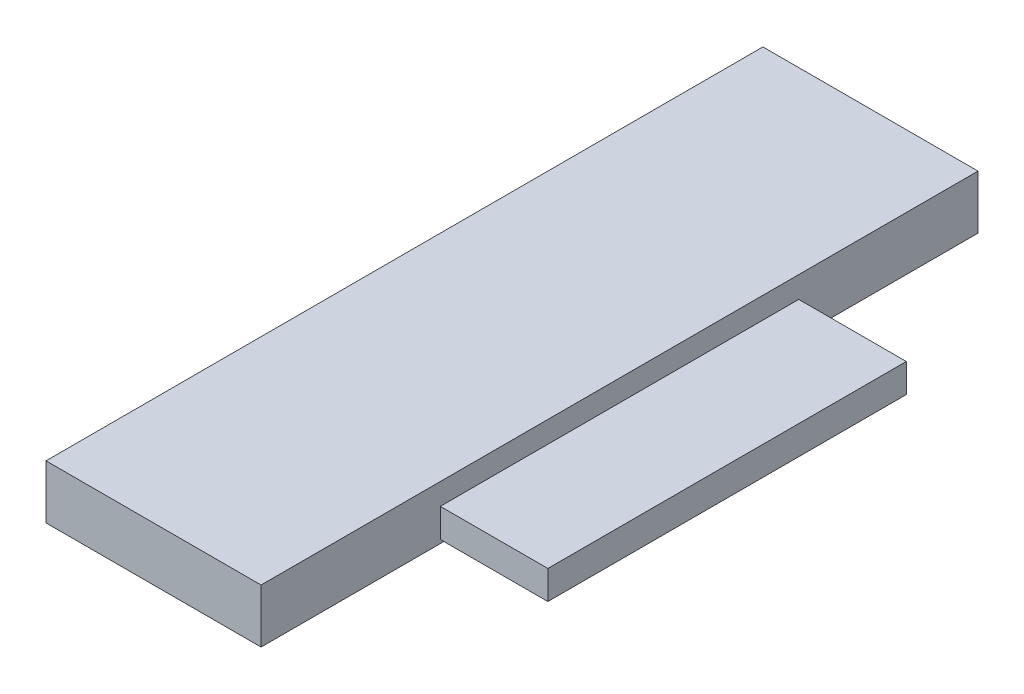
ISO-10303-21;
HEADER;
FILE_DESCRIPTION(('STEP AP214'),'2;1');
FILE_NAME('part.step','',(''),(''),'','','');
FILE_SCHEMA(('AUTOMOTIVE_DESIGN { 1 0 10303 214 1 1 1 1 }'));
ENDSEC;
DATA;
#1=APPLICATION_CONTEXT('core data for automotive mechanical design processes');
#2=APPLICATION_PROTOCOL_DEFINITION('international standard','automotive_design',2000,#1);
#3=PRODUCT_CONTEXT('',#1,'mechanical');
#4=PRODUCT('Part','Part','',(#3));
#5=PRODUCT_RELATED_PRODUCT_CATEGORY('part','',(#4));
#6=PRODUCT_DEFINITION_FORMATION('','',#4);
#7=PRODUCT_DEFINITION_CONTEXT('part definition',#1,'design');
#8=PRODUCT_DEFINITION('design','',#6,#7);
#9=PRODUCT_DEFINITION_SHAPE('','',#8);
#10=(LENGTH_UNIT() NAMED_UNIT(*) SI_UNIT(.MILLI.,.METRE.));
#11=(NAMED_UNIT(*) PLANE_ANGLE_UNIT() SI_UNIT($,.RADIAN.));
#12=(NAMED_UNIT(*) SI_UNIT($,.STERADIAN.) SOLID_ANGLE_UNIT());
#13=UNCERTAINTY_MEASURE_WITH_UNIT(LENGTH_MEASURE(1.E-05),#10,'distance_accuracy_value','');
#14=(GEOMETRIC_REPRESENTATION_CONTEXT(3) GLOBAL_UNCERTAINTY_ASSIGNED_CONTEXT((#13)) GLOBAL_UNIT_ASSIGNED_CONTEXT((#10,
#11,#12)) REPRESENTATION_CONTEXT('',''));
#15=CARTESIAN_POINT('',(0.,0.,0.));
#16=DIRECTION('',(0.,0.,1.));
#17=DIRECTION('',(1.,0.,0.));
#18=AXIS2_PLACEMENT_3D('',#15,#16,#17);
#19=CARTESIAN_POINT('',(0.,3.75,-50.));
#20=DIRECTION('',(-1.,0.,0.));
#21=DIRECTION('',(0.,0.,1.));
#22=AXIS2_PLACEMENT_3D('',#19,#20,#21);
#23=PLANE('',#22);
#24=DIRECTION('',(0.,0.,-1.));
#25=VECTOR('',#24,1.);
#26=CARTESIAN_POINT('',(0.,-3.75,-50.));
#27=LINE('',#26,#25);
#28=CARTESIAN_POINT('',(0.,-3.75,50.));
#29=VERTEX_POINT('',#28);
#30=CARTESIAN_POINT('',(0.,-3.75,-50.));
#31=VERTEX_POINT('',#30);
#32=EDGE_CURVE('E165',#29,#31,#27,.T.);
#33=ORIENTED_EDGE('',*,*,#32,.T.);
#34=DIRECTION('',(0.,-1.,0.));
#35=VECTOR('',#34,1.);
#36=CARTESIAN_POINT('',(0.,3.75,-50.));
#37=LINE('',#36,#35);
#38=CARTESIAN_POINT('',(0.,3.75,-50.));
#39=VERTEX_POINT('',#38);
#40=EDGE_CURVE('E169',#39,#31,#37,.T.);
#41=ORIENTED_EDGE('',*,*,#40,.F.);
#42=DIRECTION('',(0.,0.,-1.));
#43=VECTOR('',#42,1.);
#44=CARTESIAN_POINT('',(0.,3.75,-50.));
#45=LINE('',#44,#43);
#46=CARTESIAN_POINT('',(0.,3.75,50.));
#47=VERTEX_POINT('',#46);
#48=EDGE_CURVE('E157',#47,#39,#45,.T.);
#49=ORIENTED_EDGE('',*,*,#48,.F.);
#50=DIRECTION('',(0.,-1.,0.));
#51=VECTOR('',#50,1.);
#52=CARTESIAN_POINT('',(0.,3.75,50.));
#53=LINE('',#52,#51);
#54=EDGE_CURVE('E49',#47,#29,#53,.T.);
#55=ORIENTED_EDGE('',*,*,#54,.T.);
#56=EDGE_LOOP('',(#33,#41,#49,#55));
#57=FACE_BOUND('',#56,.T.);
#58=DIRECTION('',(0.,0.,1.));
#59=VECTOR('',#58,1.);
#60=CARTESIAN_POINT('',(0.,0.75,-25.));
#61=LINE('',#60,#59);
#62=CARTESIAN_POINT('',(0.,0.75,-25.));
#63=VERTEX_POINT('',#62);
#64=CARTESIAN_POINT('',(0.,0.75,25.));
#65=VERTEX_POINT('',#64);
#66=EDGE_CURVE('E56',#63,#65,#61,.T.);
#67=ORIENTED_EDGE('',*,*,#66,.F.);
#68=DIRECTION('',(0.,1.,0.));
#69=VECTOR('',#68,1.);
#70=CARTESIAN_POINT('',(0.,-3.25,-25.));
#71=LINE('',#70,#69);
#72=CARTESIAN_POINT('',(0.,-3.25,-25.));
#73=VERTEX_POINT('',#72);
#74=EDGE_CURVE('E137',#73,#63,#71,.T.);
#75=ORIENTED_EDGE('',*,*,#74,.F.);
#76=DIRECTION('',(0.,0.,1.));
#77=VECTOR('',#76,1.);
#78=CARTESIAN_POINT('',(0.,-3.25,-25.));
#79=LINE('',#78,#77);
#80=CARTESIAN_POINT('',(0.,-3.25,25.));
#81=VERTEX_POINT('',#80);
#82=EDGE_CURVE('E131',#73,#81,#79,.T.);
#83=ORIENTED_EDGE('',*,*,#82,.T.);
#84=DIRECTION('',(0.,1.,0.));
#85=VECTOR('',#84,1.);
#86=CARTESIAN_POINT('',(0.,-3.25,25.));
#87=LINE('',#86,#85);
#88=EDGE_CURVE('E117',#81,#65,#87,.T.);
#89=ORIENTED_EDGE('',*,*,#88,.T.);
#90=EDGE_LOOP('',(#67,#75,#83,#89));
#91=FACE_BOUND('',#90,.T.);
#92=ADVANCED_FACE('F41',(#57,#91),#23,.F.);
#93=CARTESIAN_POINT('',(-30.,3.75,-50.));
#94=DIRECTION('',(1.,0.,0.));
#95=DIRECTION('',(0.,0.,-1.));
#96=AXIS2_PLACEMENT_3D('',#93,#94,#95);
#97=PLANE('',#96);
#98=DIRECTION('',(0.,0.,1.));
#99=VECTOR('',#98,1.);
#100=CARTESIAN_POINT('',(-30.,-3.75,-50.));
#101=LINE('',#100,#99);
#102=CARTESIAN_POINT('',(-30.,-3.75,-50.));
#103=VERTEX_POINT('',#102);
#104=CARTESIAN_POINT('',(-30.,-3.75,50.));
#105=VERTEX_POINT('',#104);
#106=EDGE_CURVE('E150',#103,#105,#101,.T.);
#107=ORIENTED_EDGE('',*,*,#106,.T.);
#108=DIRECTION('',(0.,-1.,0.));
#109=VECTOR('',#108,1.);
#110=CARTESIAN_POINT('',(-30.,3.75,50.));
#111=LINE('',#110,#109);
#112=CARTESIAN_POINT('',(-30.,3.75,50.));
#113=VERTEX_POINT('',#112);
#114=EDGE_CURVE('E11',#113,#105,#111,.T.);
#115=ORIENTED_EDGE('',*,*,#114,.F.);
#116=DIRECTION('',(0.,0.,1.));
#117=VECTOR('',#116,1.);
#118=CARTESIAN_POINT('',(-30.,3.75,-50.));
#119=LINE('',#118,#117);
#120=CARTESIAN_POINT('',(-30.,3.75,-50.));
#121=VERTEX_POINT('',#120);
#122=EDGE_CURVE('E154',#121,#113,#119,.T.);
#123=ORIENTED_EDGE('',*,*,#122,.F.);
#124=DIRECTION('',(0.,-1.,0.));
#125=VECTOR('',#124,1.);
#126=CARTESIAN_POINT('',(-30.,3.75,-50.));
#127=LINE('',#126,#125);
#128=EDGE_CURVE('E160',#121,#103,#127,.T.);
#129=ORIENTED_EDGE('',*,*,#128,.T.);
#130=EDGE_LOOP('',(#107,#115,#123,#129));
#131=FACE_BOUND('',#130,.T.);
#132=ADVANCED_FACE('F43',(#131),#97,.F.);
#133=CARTESIAN_POINT('',(-30.,3.75,50.));
#134=DIRECTION('',(0.,0.,-1.));
#135=DIRECTION('',(-1.,0.,0.));
#136=AXIS2_PLACEMENT_3D('',#133,#134,#135);
#137=PLANE('',#136);
#138=DIRECTION('',(1.,0.,0.));
#139=VECTOR('',#138,1.);
#140=CARTESIAN_POINT('',(-30.,-3.75,50.));
#141=LINE('',#140,#139);
#142=EDGE_CURVE('E163',#105,#29,#141,.T.);
#143=ORIENTED_EDGE('',*,*,#142,.T.);
#144=ORIENTED_EDGE('',*,*,#54,.F.);
#145=DIRECTION('',(1.,0.,0.));
#146=VECTOR('',#145,1.);
#147=CARTESIAN_POINT('',(-30.,3.75,50.));
#148=LINE('',#147,#146);
#149=EDGE_CURVE('E93',#113,#47,#148,.T.);
#150=ORIENTED_EDGE('',*,*,#149,.F.);
#151=ORIENTED_EDGE('',*,*,#114,.T.);
#152=EDGE_LOOP('',(#143,#144,#150,#151));
#153=FACE_BOUND('',#152,.T.);
#154=ADVANCED_FACE('F184',(#153),#137,.F.);
#155=CARTESIAN_POINT('',(-30.,3.75,-50.));
#156=DIRECTION('',(0.,0.,1.));
#157=DIRECTION('',(1.,0.,0.));
#158=AXIS2_PLACEMENT_3D('',#155,#156,#157);
#159=PLANE('',#158);
#160=DIRECTION('',(-1.,0.,0.));
#161=VECTOR('',#160,1.);
#162=CARTESIAN_POINT('',(-30.,-3.75,-50.));
#163=LINE('',#162,#161);
#164=EDGE_CURVE('E86',#31,#103,#163,.T.);
#165=ORIENTED_EDGE('',*,*,#164,.T.);
#166=ORIENTED_EDGE('',*,*,#128,.F.);
#167=DIRECTION('',(-1.,0.,0.));
#168=VECTOR('',#167,1.);
#169=CARTESIAN_POINT('',(-30.,3.75,-50.));
#170=LINE('',#169,#168);
#171=EDGE_CURVE('E65',#39,#121,#170,.T.);
#172=ORIENTED_EDGE('',*,*,#171,.F.);
#173=ORIENTED_EDGE('',*,*,#40,.T.);
#174=EDGE_LOOP('',(#165,#166,#172,#173));
#175=FACE_BOUND('',#174,.T.);
#176=ADVANCED_FACE('F181',(#175),#159,.F.);
#177=CARTESIAN_POINT('',(0.,3.75,0.));
#178=DIRECTION('',(0.,1.,0.));
#179=DIRECTION('',(0.,0.,1.));
#180=AXIS2_PLACEMENT_3D('',#177,#178,#179);
#181=PLANE('',#180);
#182=ORIENTED_EDGE('',*,*,#122,.T.);
#183=ORIENTED_EDGE('',*,*,#149,.T.);
#184=ORIENTED_EDGE('',*,*,#48,.T.);
#185=ORIENTED_EDGE('',*,*,#171,.T.);
#186=EDGE_LOOP('',(#182,#183,#184,#185));
#187=FACE_BOUND('',#186,.T.);
#188=ADVANCED_FACE('F183',(#187),#181,.T.);
#189=CARTESIAN_POINT('',(0.,-3.75,0.));
#190=DIRECTION('',(0.,1.,0.));
#191=DIRECTION('',(0.,0.,1.));
#192=AXIS2_PLACEMENT_3D('',#189,#190,#191);
#193=PLANE('',#192);
#194=ORIENTED_EDGE('',*,*,#106,.F.);
#195=ORIENTED_EDGE('',*,*,#164,.F.);
#196=ORIENTED_EDGE('',*,*,#32,.F.);
#197=ORIENTED_EDGE('',*,*,#142,.F.);
#198=EDGE_LOOP('',(#194,#195,#196,#197));
#199=FACE_BOUND('',#198,.T.);
#200=ADVANCED_FACE('F177',(#199),#193,.F.);
#201=CARTESIAN_POINT('',(0.,-3.25,-25.));
#202=DIRECTION('',(0.,0.,-1.));
#203=DIRECTION('',(-1.,0.,0.));
#204=AXIS2_PLACEMENT_3D('',#201,#202,#203);
#205=PLANE('',#204);
#206=DIRECTION('',(-1.,0.,0.));
#207=VECTOR('',#206,1.);
#208=CARTESIAN_POINT('',(0.,0.75,-25.));
#209=LINE('',#208,#207);
#210=CARTESIAN_POINT('',(15.,0.75,-25.));
#211=VERTEX_POINT('',#210);
#212=EDGE_CURVE('E138',#211,#63,#209,.T.);
#213=ORIENTED_EDGE('',*,*,#212,.F.);
#214=DIRECTION('',(0.,1.,0.));
#215=VECTOR('',#214,1.);
#216=CARTESIAN_POINT('',(15.,-3.25,-25.));
#217=LINE('',#216,#215);
#218=CARTESIAN_POINT('',(15.,-3.25,-25.));
#219=VERTEX_POINT('',#218);
#220=EDGE_CURVE('E151',#219,#211,#217,.T.);
#221=ORIENTED_EDGE('',*,*,#220,.F.);
#222=DIRECTION('',(-1.,0.,0.));
#223=VECTOR('',#222,1.);
#224=CARTESIAN_POINT('',(0.,-3.25,-25.));
#225=LINE('',#224,#223);
#226=EDGE_CURVE('E125',#219,#73,#225,.T.);
#227=ORIENTED_EDGE('',*,*,#226,.T.);
#228=ORIENTED_EDGE('',*,*,#74,.T.);
#229=EDGE_LOOP('',(#213,#221,#227,#228));
#230=FACE_BOUND('',#229,.T.);
#231=ADVANCED_FACE('F222',(#230),#205,.T.);
#232=CARTESIAN_POINT('',(15.,-3.25,-25.));
#233=DIRECTION('',(1.,0.,0.));
#234=DIRECTION('',(0.,0.,-1.));
#235=AXIS2_PLACEMENT_3D('',#232,#233,#234);
#236=PLANE('',#235);
#237=DIRECTION('',(0.,0.,-1.));
#238=VECTOR('',#237,1.);
#239=CARTESIAN_POINT('',(15.,0.75,-25.));
#240=LINE('',#239,#238);
#241=CARTESIAN_POINT('',(15.,0.75,25.));
#242=VERTEX_POINT('',#241);
#243=EDGE_CURVE('E140',#242,#211,#240,.T.);
#244=ORIENTED_EDGE('',*,*,#243,.F.);
#245=DIRECTION('',(0.,1.,0.));
#246=VECTOR('',#245,1.);
#247=CARTESIAN_POINT('',(15.,-3.25,25.));
#248=LINE('',#247,#246);
#249=CARTESIAN_POINT('',(15.,-3.25,25.));
#250=VERTEX_POINT('',#249);
#251=EDGE_CURVE('E124',#250,#242,#248,.T.);
#252=ORIENTED_EDGE('',*,*,#251,.F.);
#253=DIRECTION('',(0.,0.,-1.));
#254=VECTOR('',#253,1.);
#255=CARTESIAN_POINT('',(15.,-3.25,-25.));
#256=LINE('',#255,#254);
#257=EDGE_CURVE('E134',#250,#219,#256,.T.);
#258=ORIENTED_EDGE('',*,*,#257,.T.);
#259=ORIENTED_EDGE('',*,*,#220,.T.);
#260=EDGE_LOOP('',(#244,#252,#258,#259));
#261=FACE_BOUND('',#260,.T.);
#262=ADVANCED_FACE('F234',(#261),#236,.T.);
#263=CARTESIAN_POINT('',(0.,-3.25,25.));
#264=DIRECTION('',(0.,0.,1.));
#265=DIRECTION('',(1.,0.,0.));
#266=AXIS2_PLACEMENT_3D('',#263,#264,#265);
#267=PLANE('',#266);
#268=DIRECTION('',(1.,0.,0.));
#269=VECTOR('',#268,1.);
#270=CARTESIAN_POINT('',(0.,0.75,25.));
#271=LINE('',#270,#269);
#272=EDGE_CURVE('E121',#65,#242,#271,.T.);
#273=ORIENTED_EDGE('',*,*,#272,.F.);
#274=ORIENTED_EDGE('',*,*,#88,.F.);
#275=DIRECTION('',(1.,0.,0.));
#276=VECTOR('',#275,1.);
#277=CARTESIAN_POINT('',(0.,-3.25,25.));
#278=LINE('',#277,#276);
#279=EDGE_CURVE('E120',#81,#250,#278,.T.);
#280=ORIENTED_EDGE('',*,*,#279,.T.);
#281=ORIENTED_EDGE('',*,*,#251,.T.);
#282=EDGE_LOOP('',(#273,#274,#280,#281));
#283=FACE_BOUND('',#282,.T.);
#284=ADVANCED_FACE('F119',(#283),#267,.T.);
#285=CARTESIAN_POINT('',(0.,-3.25,0.));
#286=DIRECTION('',(0.,1.,0.));
#287=DIRECTION('',(0.,0.,1.));
#288=AXIS2_PLACEMENT_3D('',#285,#286,#287);
#289=PLANE('',#288);
#290=ORIENTED_EDGE('',*,*,#82,.F.);
#291=ORIENTED_EDGE('',*,*,#226,.F.);
#292=ORIENTED_EDGE('',*,*,#257,.F.);
#293=ORIENTED_EDGE('',*,*,#279,.F.);
#294=EDGE_LOOP('',(#290,#291,#292,#293));
#295=FACE_BOUND('',#294,.T.);
#296=ADVANCED_FACE('F129',(#295),#289,.F.);
#297=CARTESIAN_POINT('',(0.,0.75,0.));
#298=DIRECTION('',(0.,1.,0.));
#299=DIRECTION('',(0.,0.,1.));
#300=AXIS2_PLACEMENT_3D('',#297,#298,#299);
#301=PLANE('',#300);
#302=ORIENTED_EDGE('',*,*,#66,.T.);
#303=ORIENTED_EDGE('',*,*,#272,.T.);
#304=ORIENTED_EDGE('',*,*,#243,.T.);
#305=ORIENTED_EDGE('',*,*,#212,.T.);
#306=EDGE_LOOP('',(#302,#303,#304,#305));
#307=FACE_BOUND('',#306,.T.);
#308=ADVANCED_FACE('F254',(#307),#301,.T.);
#309=CLOSED_SHELL('',(#92,#132,#154,#176,#188,#200,#231,#262,#284,#296,#308));
#310=MANIFOLD_SOLID_BREP('B2',#309);
#311=ADVANCED_BREP_SHAPE_REPRESENTATION('',(#18,#310),#14);
#312=SHAPE_DEFINITION_REPRESENTATION(#9,#311);
ENDSEC;
END-ISO-10303-21;
